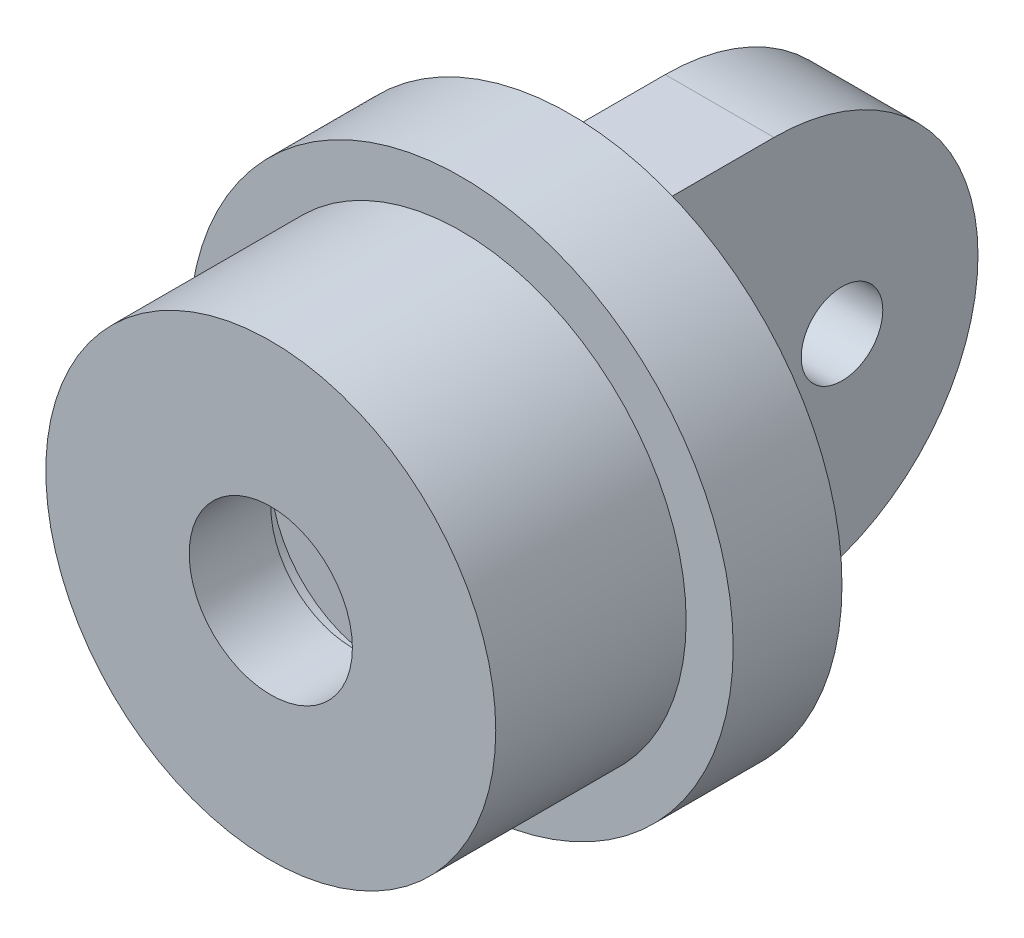
ISO-10303-21;
HEADER;
FILE_DESCRIPTION(('STEP AP214'),'2;1');
FILE_NAME('part.step','',(''),(''),'','','');
FILE_SCHEMA(('AUTOMOTIVE_DESIGN { 1 0 10303 214 1 1 1 1 }'));
ENDSEC;
DATA;
#1=APPLICATION_CONTEXT('core data for automotive mechanical design processes');
#2=APPLICATION_PROTOCOL_DEFINITION('international standard','automotive_design',2000,#1);
#3=PRODUCT_CONTEXT('',#1,'mechanical');
#4=PRODUCT('Part','Part','',(#3));
#5=PRODUCT_RELATED_PRODUCT_CATEGORY('part','',(#4));
#6=PRODUCT_DEFINITION_FORMATION('','',#4);
#7=PRODUCT_DEFINITION_CONTEXT('part definition',#1,'design');
#8=PRODUCT_DEFINITION('design','',#6,#7);
#9=PRODUCT_DEFINITION_SHAPE('','',#8);
#10=(LENGTH_UNIT() NAMED_UNIT(*) SI_UNIT(.MILLI.,.METRE.));
#11=(NAMED_UNIT(*) PLANE_ANGLE_UNIT() SI_UNIT($,.RADIAN.));
#12=(NAMED_UNIT(*) SI_UNIT($,.STERADIAN.) SOLID_ANGLE_UNIT());
#13=UNCERTAINTY_MEASURE_WITH_UNIT(LENGTH_MEASURE(1.E-05),#10,'distance_accuracy_value','');
#14=(GEOMETRIC_REPRESENTATION_CONTEXT(3) GLOBAL_UNCERTAINTY_ASSIGNED_CONTEXT((#13)) GLOBAL_UNIT_ASSIGNED_CONTEXT((#10,
#11,#12)) REPRESENTATION_CONTEXT('',''));
#15=CARTESIAN_POINT('',(0.,0.,0.));
#16=DIRECTION('',(0.,0.,1.));
#17=DIRECTION('',(1.,0.,0.));
#18=AXIS2_PLACEMENT_3D('',#15,#16,#17);
#19=CARTESIAN_POINT('',(0.,0.,35.));
#20=DIRECTION('',(0.,0.,1.));
#21=DIRECTION('',(1.,0.,0.));
#22=AXIS2_PLACEMENT_3D('',#19,#20,#21);
#23=CYLINDRICAL_SURFACE('',#22,15.);
#24=CARTESIAN_POINT('',(0.,0.,55.));
#25=DIRECTION('',(0.,0.,1.));
#26=DIRECTION('',(1.,0.,0.));
#27=AXIS2_PLACEMENT_3D('',#24,#25,#26);
#28=CIRCLE('',#27,15.);
#29=CARTESIAN_POINT('',(15.,0.,55.));
#30=VERTEX_POINT('',#29);
#31=EDGE_CURVE('E139',#30,#30,#28,.T.);
#32=ORIENTED_EDGE('',*,*,#31,.T.);
#33=EDGE_LOOP('',(#32));
#34=FACE_BOUND('',#33,.T.);
#35=CARTESIAN_POINT('',(0.,0.,40.));
#36=DIRECTION('',(0.,0.,-1.));
#37=DIRECTION('',(-1.,0.,0.));
#38=AXIS2_PLACEMENT_3D('',#35,#36,#37);
#39=CIRCLE('',#38,15.);
#40=CARTESIAN_POINT('',(-15.,0.,40.));
#41=VERTEX_POINT('',#40);
#42=EDGE_CURVE('E37',#41,#41,#39,.F.);
#43=ORIENTED_EDGE('',*,*,#42,.F.);
#44=EDGE_LOOP('',(#43));
#45=FACE_BOUND('',#44,.T.);
#46=ADVANCED_FACE('F33',(#34,#45),#23,.F.);
#47=CARTESIAN_POINT('',(0.,0.,0.));
#48=DIRECTION('',(0.,0.,1.));
#49=DIRECTION('',(1.,0.,0.));
#50=AXIS2_PLACEMENT_3D('',#47,#48,#49);
#51=PLANE('',#50);
#52=CARTESIAN_POINT('',(0.,0.,0.));
#53=DIRECTION('',(0.,0.,1.));
#54=DIRECTION('',(1.,0.,0.));
#55=AXIS2_PLACEMENT_3D('',#52,#53,#54);
#56=CIRCLE('',#55,50.);
#57=CARTESIAN_POINT('',(50.,0.,0.));
#58=VERTEX_POINT('',#57);
#59=EDGE_CURVE('E114',#58,#58,#56,.T.);
#60=ORIENTED_EDGE('',*,*,#59,.F.);
#61=EDGE_LOOP('',(#60));
#62=FACE_BOUND('',#61,.T.);
#63=DIRECTION('',(-1.,0.,0.));
#64=VECTOR('',#63,1.);
#65=CARTESIAN_POINT('',(10.,-37.5,0.));
#66=LINE('',#65,#64);
#67=CARTESIAN_POINT('',(10.,-37.5,0.));
#68=VERTEX_POINT('',#67);
#69=CARTESIAN_POINT('',(-10.,-37.5,0.));
#70=VERTEX_POINT('',#69);
#71=EDGE_CURVE('E103',#68,#70,#66,.T.);
#72=ORIENTED_EDGE('',*,*,#71,.F.);
#73=DIRECTION('',(0.,1.,0.));
#74=VECTOR('',#73,1.);
#75=CARTESIAN_POINT('',(10.,-37.5,0.));
#76=LINE('',#75,#74);
#77=CARTESIAN_POINT('',(10.,37.5,0.));
#78=VERTEX_POINT('',#77);
#79=EDGE_CURVE('E99',#68,#78,#76,.T.);
#80=ORIENTED_EDGE('',*,*,#79,.T.);
#81=DIRECTION('',(-1.,0.,0.));
#82=VECTOR('',#81,1.);
#83=CARTESIAN_POINT('',(10.,37.5,0.));
#84=LINE('',#83,#82);
#85=CARTESIAN_POINT('',(-10.,37.5,0.));
#86=VERTEX_POINT('',#85);
#87=EDGE_CURVE('E83',#78,#86,#84,.T.);
#88=ORIENTED_EDGE('',*,*,#87,.T.);
#89=DIRECTION('',(0.,1.,0.));
#90=VECTOR('',#89,1.);
#91=CARTESIAN_POINT('',(-10.,-37.5,0.));
#92=LINE('',#91,#90);
#93=EDGE_CURVE('E96',#70,#86,#92,.T.);
#94=ORIENTED_EDGE('',*,*,#93,.F.);
#95=EDGE_LOOP('',(#72,#80,#88,#94));
#96=FACE_BOUND('',#95,.T.);
#97=ADVANCED_FACE('F95',(#62,#96),#51,.F.);
#98=CARTESIAN_POINT('',(0.,0.,20.));
#99=DIRECTION('',(0.,0.,-1.));
#100=DIRECTION('',(-1.,0.,0.));
#101=AXIS2_PLACEMENT_3D('',#98,#99,#100);
#102=CYLINDRICAL_SURFACE('',#101,50.);
#103=CARTESIAN_POINT('',(0.,0.,20.));
#104=DIRECTION('',(0.,0.,1.));
#105=DIRECTION('',(1.,0.,0.));
#106=AXIS2_PLACEMENT_3D('',#103,#104,#105);
#107=CIRCLE('',#106,50.);
#108=CARTESIAN_POINT('',(50.,0.,20.));
#109=VERTEX_POINT('',#108);
#110=EDGE_CURVE('E115',#109,#109,#107,.T.);
#111=ORIENTED_EDGE('',*,*,#110,.F.);
#112=EDGE_LOOP('',(#111));
#113=FACE_BOUND('',#112,.T.);
#114=ORIENTED_EDGE('',*,*,#59,.T.);
#115=EDGE_LOOP('',(#114));
#116=FACE_BOUND('',#115,.T.);
#117=ADVANCED_FACE('F170',(#113,#116),#102,.T.);
#118=CARTESIAN_POINT('',(0.,0.,20.));
#119=DIRECTION('',(0.,0.,1.));
#120=DIRECTION('',(1.,0.,0.));
#121=AXIS2_PLACEMENT_3D('',#118,#119,#120);
#122=PLANE('',#121);
#123=CARTESIAN_POINT('',(0.,0.,20.));
#124=DIRECTION('',(0.,0.,1.));
#125=DIRECTION('',(1.,0.,0.));
#126=AXIS2_PLACEMENT_3D('',#123,#124,#125);
#127=CIRCLE('',#126,41.3556096652742);
#128=CARTESIAN_POINT('',(41.3556096652742,0.,20.));
#129=VERTEX_POINT('',#128);
#130=EDGE_CURVE('E11',#129,#129,#127,.T.);
#131=ORIENTED_EDGE('',*,*,#130,.F.);
#132=EDGE_LOOP('',(#131));
#133=FACE_BOUND('',#132,.T.);
#134=ORIENTED_EDGE('',*,*,#110,.T.);
#135=EDGE_LOOP('',(#134));
#136=FACE_BOUND('',#135,.T.);
#137=ADVANCED_FACE('F191',(#133,#136),#122,.T.);
#138=CARTESIAN_POINT('',(10.,-37.5,-65.));
#139=DIRECTION('',(0.,1.,0.));
#140=DIRECTION('',(0.,0.,1.));
#141=AXIS2_PLACEMENT_3D('',#138,#139,#140);
#142=PLANE('',#141);
#143=DIRECTION('',(0.,0.,1.));
#144=VECTOR('',#143,1.);
#145=CARTESIAN_POINT('',(-10.,-37.5,-65.));
#146=LINE('',#145,#144);
#147=CARTESIAN_POINT('',(-10.,-37.5,-27.5));
#148=VERTEX_POINT('',#147);
#149=EDGE_CURVE('E88',#148,#70,#146,.T.);
#150=ORIENTED_EDGE('',*,*,#149,.F.);
#151=DIRECTION('',(-1.,0.,0.));
#152=VECTOR('',#151,1.);
#153=CARTESIAN_POINT('',(10.,-37.5,-27.5));
#154=LINE('',#153,#152);
#155=CARTESIAN_POINT('',(10.,-37.5,-27.5));
#156=VERTEX_POINT('',#155);
#157=EDGE_CURVE('E124',#148,#156,#154,.F.);
#158=ORIENTED_EDGE('',*,*,#157,.T.);
#159=DIRECTION('',(0.,0.,1.));
#160=VECTOR('',#159,1.);
#161=CARTESIAN_POINT('',(10.,-37.5,-65.));
#162=LINE('',#161,#160);
#163=EDGE_CURVE('E110',#156,#68,#162,.T.);
#164=ORIENTED_EDGE('',*,*,#163,.T.);
#165=ORIENTED_EDGE('',*,*,#71,.T.);
#166=EDGE_LOOP('',(#150,#158,#164,#165));
#167=FACE_BOUND('',#166,.T.);
#168=ADVANCED_FACE('F194',(#167),#142,.F.);
#169=CARTESIAN_POINT('',(-10.,-37.5,-65.));
#170=DIRECTION('',(1.,0.,0.));
#171=DIRECTION('',(0.,0.,-1.));
#172=AXIS2_PLACEMENT_3D('',#169,#170,#171);
#173=PLANE('',#172);
#174=CARTESIAN_POINT('',(-10.,0.,-39.9968071519795));
#175=DIRECTION('',(1.,0.,0.));
#176=DIRECTION('',(0.,0.,-1.));
#177=AXIS2_PLACEMENT_3D('',#174,#175,#176);
#178=CIRCLE('',#177,7.5);
#179=CARTESIAN_POINT('',(-10.,0.,-47.4968071519795));
#180=VERTEX_POINT('',#179);
#181=EDGE_CURVE('E105',#180,#180,#178,.T.);
#182=ORIENTED_EDGE('',*,*,#181,.T.);
#183=EDGE_LOOP('',(#182));
#184=FACE_BOUND('',#183,.T.);
#185=CARTESIAN_POINT('',(-10.,0.,-27.5));
#186=DIRECTION('',(1.,0.,0.));
#187=DIRECTION('',(0.,0.,-1.));
#188=AXIS2_PLACEMENT_3D('',#185,#186,#187);
#189=CIRCLE('',#188,37.5);
#190=CARTESIAN_POINT('',(-10.,37.5,-27.5));
#191=VERTEX_POINT('',#190);
#192=CARTESIAN_POINT('',(-10.,0.,-65.));
#193=VERTEX_POINT('',#192);
#194=EDGE_CURVE('E118',#191,#193,#189,.F.);
#195=ORIENTED_EDGE('',*,*,#194,.T.);
#196=CARTESIAN_POINT('',(-10.,0.,-27.5));
#197=DIRECTION('',(1.,0.,0.));
#198=DIRECTION('',(0.,0.,-1.));
#199=AXIS2_PLACEMENT_3D('',#196,#197,#198);
#200=CIRCLE('',#199,37.5);
#201=EDGE_CURVE('E122',#193,#148,#200,.F.);
#202=ORIENTED_EDGE('',*,*,#201,.T.);
#203=ORIENTED_EDGE('',*,*,#149,.T.);
#204=ORIENTED_EDGE('',*,*,#93,.T.);
#205=DIRECTION('',(0.,0.,1.));
#206=VECTOR('',#205,1.);
#207=CARTESIAN_POINT('',(-10.,37.5,-65.));
#208=LINE('',#207,#206);
#209=EDGE_CURVE('E80',#191,#86,#208,.T.);
#210=ORIENTED_EDGE('',*,*,#209,.F.);
#211=EDGE_LOOP('',(#195,#202,#203,#204,#210));
#212=FACE_BOUND('',#211,.T.);
#213=ADVANCED_FACE('F101',(#184,#212),#173,.F.);
#214=CARTESIAN_POINT('',(10.,37.5,-65.));
#215=DIRECTION('',(0.,1.,0.));
#216=DIRECTION('',(0.,0.,1.));
#217=AXIS2_PLACEMENT_3D('',#214,#215,#216);
#218=PLANE('',#217);
#219=DIRECTION('',(0.,0.,1.));
#220=VECTOR('',#219,1.);
#221=CARTESIAN_POINT('',(10.,37.5,-65.));
#222=LINE('',#221,#220);
#223=CARTESIAN_POINT('',(10.,37.5,-27.5));
#224=VERTEX_POINT('',#223);
#225=EDGE_CURVE('E89',#224,#78,#222,.T.);
#226=ORIENTED_EDGE('',*,*,#225,.F.);
#227=DIRECTION('',(-1.,0.,0.));
#228=VECTOR('',#227,1.);
#229=CARTESIAN_POINT('',(10.,37.5,-27.5));
#230=LINE('',#229,#228);
#231=EDGE_CURVE('E42',#224,#191,#230,.T.);
#232=ORIENTED_EDGE('',*,*,#231,.T.);
#233=ORIENTED_EDGE('',*,*,#209,.T.);
#234=ORIENTED_EDGE('',*,*,#87,.F.);
#235=EDGE_LOOP('',(#226,#232,#233,#234));
#236=FACE_BOUND('',#235,.T.);
#237=ADVANCED_FACE('F82',(#236),#218,.T.);
#238=CARTESIAN_POINT('',(10.,-37.5,-65.));
#239=DIRECTION('',(1.,0.,0.));
#240=DIRECTION('',(0.,0.,-1.));
#241=AXIS2_PLACEMENT_3D('',#238,#239,#240);
#242=PLANE('',#241);
#243=CARTESIAN_POINT('',(10.,0.,-39.9968071519795));
#244=DIRECTION('',(1.,0.,0.));
#245=DIRECTION('',(0.,0.,-1.));
#246=AXIS2_PLACEMENT_3D('',#243,#244,#245);
#247=CIRCLE('',#246,7.5);
#248=CARTESIAN_POINT('',(10.,0.,-47.4968071519795));
#249=VERTEX_POINT('',#248);
#250=EDGE_CURVE('E131',#249,#249,#247,.T.);
#251=ORIENTED_EDGE('',*,*,#250,.F.);
#252=EDGE_LOOP('',(#251));
#253=FACE_BOUND('',#252,.T.);
#254=ORIENTED_EDGE('',*,*,#163,.F.);
#255=CARTESIAN_POINT('',(10.,0.,-27.5));
#256=DIRECTION('',(1.,0.,0.));
#257=DIRECTION('',(0.,0.,-1.));
#258=AXIS2_PLACEMENT_3D('',#255,#256,#257);
#259=CIRCLE('',#258,37.5);
#260=CARTESIAN_POINT('',(10.,0.,-65.));
#261=VERTEX_POINT('',#260);
#262=EDGE_CURVE('E55',#156,#261,#259,.T.);
#263=ORIENTED_EDGE('',*,*,#262,.T.);
#264=CARTESIAN_POINT('',(10.,0.,-27.5));
#265=DIRECTION('',(1.,0.,0.));
#266=DIRECTION('',(0.,0.,-1.));
#267=AXIS2_PLACEMENT_3D('',#264,#265,#266);
#268=CIRCLE('',#267,37.5);
#269=EDGE_CURVE('E50',#261,#224,#268,.T.);
#270=ORIENTED_EDGE('',*,*,#269,.T.);
#271=ORIENTED_EDGE('',*,*,#225,.T.);
#272=ORIENTED_EDGE('',*,*,#79,.F.);
#273=EDGE_LOOP('',(#254,#263,#270,#271,#272));
#274=FACE_BOUND('',#273,.T.);
#275=ADVANCED_FACE('F152',(#253,#274),#242,.T.);
#276=CARTESIAN_POINT('',(-55.,0.,-39.9968071519795));
#277=DIRECTION('',(1.,0.,0.));
#278=DIRECTION('',(0.,0.,-1.));
#279=AXIS2_PLACEMENT_3D('',#276,#277,#278);
#280=CYLINDRICAL_SURFACE('',#279,7.5);
#281=ORIENTED_EDGE('',*,*,#250,.T.);
#282=EDGE_LOOP('',(#281));
#283=FACE_BOUND('',#282,.T.);
#284=ORIENTED_EDGE('',*,*,#181,.F.);
#285=EDGE_LOOP('',(#284));
#286=FACE_BOUND('',#285,.T.);
#287=ADVANCED_FACE('F150',(#283,#286),#280,.F.);
#288=CARTESIAN_POINT('',(10.,0.,-27.5));
#289=DIRECTION('',(-1.,0.,0.));
#290=DIRECTION('',(0.,0.,1.));
#291=AXIS2_PLACEMENT_3D('',#288,#289,#290);
#292=CYLINDRICAL_SURFACE('',#291,37.5);
#293=ORIENTED_EDGE('',*,*,#231,.F.);
#294=ORIENTED_EDGE('',*,*,#269,.F.);
#295=DIRECTION('',(-1.,0.,0.));
#296=VECTOR('',#295,1.);
#297=CARTESIAN_POINT('',(0.,0.,-65.));
#298=LINE('',#297,#296);
#299=EDGE_CURVE('E129',#193,#261,#298,.F.);
#300=ORIENTED_EDGE('',*,*,#299,.F.);
#301=ORIENTED_EDGE('',*,*,#194,.F.);
#302=EDGE_LOOP('',(#293,#294,#300,#301));
#303=FACE_BOUND('',#302,.T.);
#304=ADVANCED_FACE('F35',(#303),#292,.T.);
#305=CARTESIAN_POINT('',(0.,0.,-27.5));
#306=DIRECTION('',(1.,0.,0.));
#307=DIRECTION('',(0.,0.,-1.));
#308=AXIS2_PLACEMENT_3D('',#305,#306,#307);
#309=CYLINDRICAL_SURFACE('',#308,37.5);
#310=ORIENTED_EDGE('',*,*,#262,.F.);
#311=ORIENTED_EDGE('',*,*,#157,.F.);
#312=ORIENTED_EDGE('',*,*,#201,.F.);
#313=ORIENTED_EDGE('',*,*,#299,.T.);
#314=EDGE_LOOP('',(#310,#311,#312,#313));
#315=FACE_BOUND('',#314,.T.);
#316=ADVANCED_FACE('F159',(#315),#309,.T.);
#317=CARTESIAN_POINT('',(0.,0.,55.));
#318=DIRECTION('',(0.,0.,-1.));
#319=DIRECTION('',(-1.,0.,0.));
#320=AXIS2_PLACEMENT_3D('',#317,#318,#319);
#321=CYLINDRICAL_SURFACE('',#320,41.3556096652742);
#322=CARTESIAN_POINT('',(0.,0.,55.));
#323=DIRECTION('',(0.,0.,1.));
#324=DIRECTION('',(1.,0.,0.));
#325=AXIS2_PLACEMENT_3D('',#322,#323,#324);
#326=CIRCLE('',#325,41.3556096652742);
#327=CARTESIAN_POINT('',(41.3556096652742,0.,55.));
#328=VERTEX_POINT('',#327);
#329=EDGE_CURVE('E132',#328,#328,#326,.T.);
#330=ORIENTED_EDGE('',*,*,#329,.F.);
#331=EDGE_LOOP('',(#330));
#332=FACE_BOUND('',#331,.T.);
#333=ORIENTED_EDGE('',*,*,#130,.T.);
#334=EDGE_LOOP('',(#333));
#335=FACE_BOUND('',#334,.T.);
#336=ADVANCED_FACE('F181',(#332,#335),#321,.T.);
#337=CARTESIAN_POINT('',(0.,0.,55.));
#338=DIRECTION('',(0.,0.,1.));
#339=DIRECTION('',(1.,0.,0.));
#340=AXIS2_PLACEMENT_3D('',#337,#338,#339);
#341=PLANE('',#340);
#342=ORIENTED_EDGE('',*,*,#31,.F.);
#343=EDGE_LOOP('',(#342));
#344=FACE_BOUND('',#343,.T.);
#345=ORIENTED_EDGE('',*,*,#329,.T.);
#346=EDGE_LOOP('',(#345));
#347=FACE_BOUND('',#346,.T.);
#348=ADVANCED_FACE('F178',(#344,#347),#341,.T.);
#349=CARTESIAN_POINT('',(0.,20.,40.));
#350=DIRECTION('',(0.,0.,-1.));
#351=DIRECTION('',(-1.,0.,0.));
#352=AXIS2_PLACEMENT_3D('',#349,#350,#351);
#353=PLANE('',#352);
#354=CARTESIAN_POINT('',(0.,0.,40.));
#355=DIRECTION('',(0.,0.,1.));
#356=DIRECTION('',(1.,0.,0.));
#357=AXIS2_PLACEMENT_3D('',#354,#355,#356);
#358=CIRCLE('',#357,20.);
#359=CARTESIAN_POINT('',(20.,0.,40.));
#360=VERTEX_POINT('',#359);
#361=EDGE_CURVE('E291',#360,#360,#358,.T.);
#362=ORIENTED_EDGE('',*,*,#361,.F.);
#363=EDGE_LOOP('',(#362));
#364=FACE_BOUND('',#363,.T.);
#365=ORIENTED_EDGE('',*,*,#42,.T.);
#366=EDGE_LOOP('',(#365));
#367=FACE_BOUND('',#366,.T.);
#368=ADVANCED_FACE('F180',(#364,#367),#353,.T.);
#369=CARTESIAN_POINT('',(0.,0.,55.));
#370=DIRECTION('',(0.,0.,1.));
#371=DIRECTION('',(1.,0.,0.));
#372=AXIS2_PLACEMENT_3D('',#369,#370,#371);
#373=CYLINDRICAL_SURFACE('',#372,20.);
#374=ORIENTED_EDGE('',*,*,#361,.T.);
#375=EDGE_LOOP('',(#374));
#376=FACE_BOUND('',#375,.T.);
#377=CARTESIAN_POINT('',(0.,0.,35.));
#378=DIRECTION('',(0.,0.,1.));
#379=DIRECTION('',(1.,0.,0.));
#380=AXIS2_PLACEMENT_3D('',#377,#378,#379);
#381=CIRCLE('',#380,20.);
#382=CARTESIAN_POINT('',(20.,0.,35.));
#383=VERTEX_POINT('',#382);
#384=EDGE_CURVE('E289',#383,#383,#381,.T.);
#385=ORIENTED_EDGE('',*,*,#384,.F.);
#386=EDGE_LOOP('',(#385));
#387=FACE_BOUND('',#386,.T.);
#388=ADVANCED_FACE('F264',(#376,#387),#373,.F.);
#389=CARTESIAN_POINT('',(0.,0.,35.));
#390=DIRECTION('',(0.,0.,1.));
#391=DIRECTION('',(1.,0.,0.));
#392=AXIS2_PLACEMENT_3D('',#389,#390,#391);
#393=PLANE('',#392);
#394=ORIENTED_EDGE('',*,*,#384,.T.);
#395=EDGE_LOOP('',(#394));
#396=FACE_BOUND('',#395,.T.);
#397=ADVANCED_FACE('F176',(#396),#393,.T.);
#398=CLOSED_SHELL('',(#46,#97,#117,#137,#168,#213,#237,#275,#287,#304,#316,#336,#348,#368,#388,#397));
#399=MANIFOLD_SOLID_BREP('B2',#398);
#400=ADVANCED_BREP_SHAPE_REPRESENTATION('',(#18,#399),#14);
#401=SHAPE_DEFINITION_REPRESENTATION(#9,#400);
ENDSEC;
END-ISO-10303-21;
